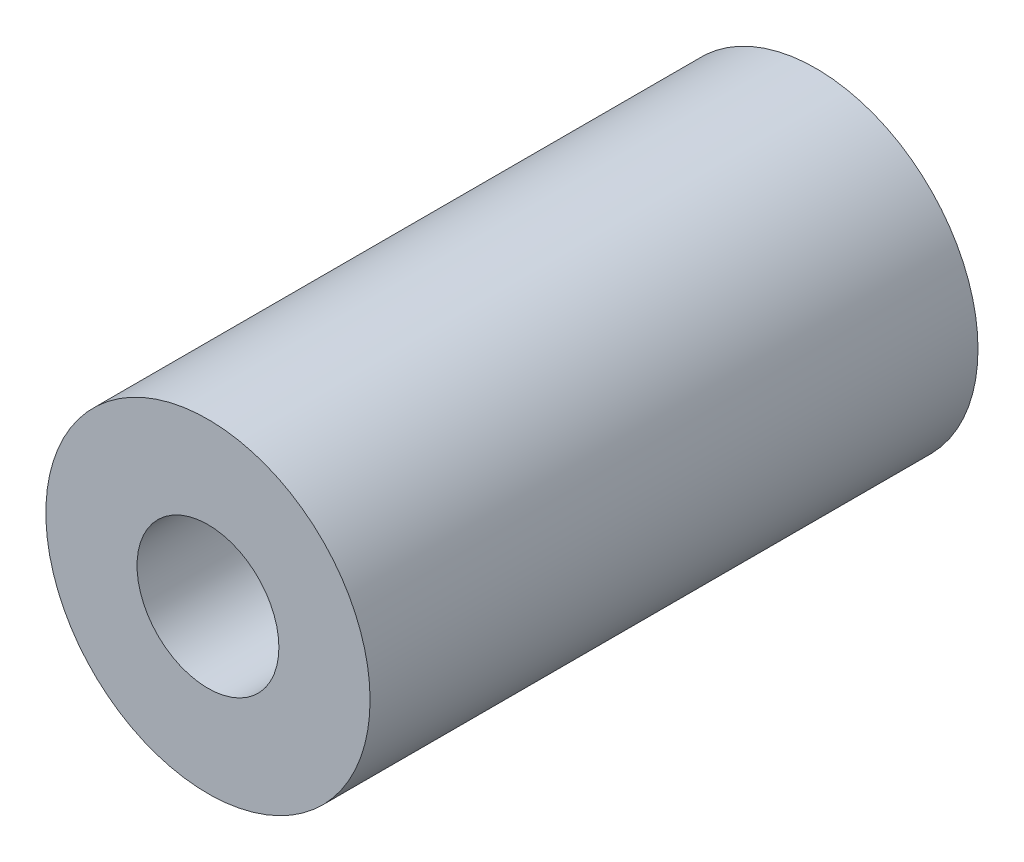
ISO-10303-21;
HEADER;
FILE_DESCRIPTION(('STEP AP214'),'2;1');
FILE_NAME('part.step','',(''),(''),'','','');
FILE_SCHEMA(('AUTOMOTIVE_DESIGN { 1 0 10303 214 1 1 1 1 }'));
ENDSEC;
DATA;
#1=APPLICATION_CONTEXT('core data for automotive mechanical design processes');
#2=APPLICATION_PROTOCOL_DEFINITION('international standard','automotive_design',2000,#1);
#3=PRODUCT_CONTEXT('',#1,'mechanical');
#4=PRODUCT('Part','Part','',(#3));
#5=PRODUCT_RELATED_PRODUCT_CATEGORY('part','',(#4));
#6=PRODUCT_DEFINITION_FORMATION('','',#4);
#7=PRODUCT_DEFINITION_CONTEXT('part definition',#1,'design');
#8=PRODUCT_DEFINITION('design','',#6,#7);
#9=PRODUCT_DEFINITION_SHAPE('','',#8);
#10=(LENGTH_UNIT() NAMED_UNIT(*) SI_UNIT(.MILLI.,.METRE.));
#11=(NAMED_UNIT(*) PLANE_ANGLE_UNIT() SI_UNIT($,.RADIAN.));
#12=(NAMED_UNIT(*) SI_UNIT($,.STERADIAN.) SOLID_ANGLE_UNIT());
#13=UNCERTAINTY_MEASURE_WITH_UNIT(LENGTH_MEASURE(1.E-05),#10,'distance_accuracy_value','');
#14=(GEOMETRIC_REPRESENTATION_CONTEXT(3) GLOBAL_UNCERTAINTY_ASSIGNED_CONTEXT((#13)) GLOBAL_UNIT_ASSIGNED_CONTEXT((#10,
#11,#12)) REPRESENTATION_CONTEXT('',''));
#15=CARTESIAN_POINT('',(0.,0.,0.));
#16=DIRECTION('',(0.,0.,1.));
#17=DIRECTION('',(1.,0.,0.));
#18=AXIS2_PLACEMENT_3D('',#15,#16,#17);
#19=CARTESIAN_POINT('',(0.,0.,7.5));
#20=DIRECTION('',(0.,0.,1.));
#21=DIRECTION('',(1.,0.,0.));
#22=AXIS2_PLACEMENT_3D('',#19,#20,#21);
#23=PLANE('',#22);
#24=CARTESIAN_POINT('',(0.,0.,7.5));
#25=DIRECTION('',(0.,0.,1.));
#26=DIRECTION('',(1.,0.,0.));
#27=AXIS2_PLACEMENT_3D('',#24,#25,#26);
#28=CIRCLE('',#27,4.);
#29=CARTESIAN_POINT('',(4.,0.,7.5));
#30=VERTEX_POINT('',#29);
#31=EDGE_CURVE('E10',#30,#30,#28,.T.);
#32=ORIENTED_EDGE('',*,*,#31,.T.);
#33=EDGE_LOOP('',(#32));
#34=FACE_BOUND('',#33,.T.);
#35=CARTESIAN_POINT('',(0.,0.,7.5));
#36=DIRECTION('',(0.,0.,1.));
#37=DIRECTION('',(1.,0.,0.));
#38=AXIS2_PLACEMENT_3D('',#35,#36,#37);
#39=CIRCLE('',#38,1.75);
#40=CARTESIAN_POINT('',(1.75,0.,7.5));
#41=VERTEX_POINT('',#40);
#42=EDGE_CURVE('E42',#41,#41,#39,.T.);
#43=ORIENTED_EDGE('',*,*,#42,.F.);
#44=EDGE_LOOP('',(#43));
#45=FACE_BOUND('',#44,.T.);
#46=ADVANCED_FACE('F31',(#34,#45),#23,.T.);
#47=CARTESIAN_POINT('',(0.,0.,-7.5));
#48=DIRECTION('',(0.,0.,1.));
#49=DIRECTION('',(1.,0.,0.));
#50=AXIS2_PLACEMENT_3D('',#47,#48,#49);
#51=PLANE('',#50);
#52=CARTESIAN_POINT('',(0.,0.,-7.5));
#53=DIRECTION('',(0.,0.,1.));
#54=DIRECTION('',(1.,0.,0.));
#55=AXIS2_PLACEMENT_3D('',#52,#53,#54);
#56=CIRCLE('',#55,4.);
#57=CARTESIAN_POINT('',(4.,0.,-7.5));
#58=VERTEX_POINT('',#57);
#59=EDGE_CURVE('E35',#58,#58,#56,.T.);
#60=ORIENTED_EDGE('',*,*,#59,.F.);
#61=EDGE_LOOP('',(#60));
#62=FACE_BOUND('',#61,.T.);
#63=CARTESIAN_POINT('',(0.,0.,-7.5));
#64=DIRECTION('',(0.,0.,1.));
#65=DIRECTION('',(1.,0.,0.));
#66=AXIS2_PLACEMENT_3D('',#63,#64,#65);
#67=CIRCLE('',#66,1.75);
#68=CARTESIAN_POINT('',(1.75,0.,-7.5));
#69=VERTEX_POINT('',#68);
#70=EDGE_CURVE('E44',#69,#69,#67,.T.);
#71=ORIENTED_EDGE('',*,*,#70,.T.);
#72=EDGE_LOOP('',(#71));
#73=FACE_BOUND('',#72,.T.);
#74=ADVANCED_FACE('F54',(#62,#73),#51,.F.);
#75=CARTESIAN_POINT('',(0.,0.,7.5));
#76=DIRECTION('',(0.,0.,-1.));
#77=DIRECTION('',(-1.,0.,0.));
#78=AXIS2_PLACEMENT_3D('',#75,#76,#77);
#79=CYLINDRICAL_SURFACE('',#78,4.);
#80=ORIENTED_EDGE('',*,*,#31,.F.);
#81=EDGE_LOOP('',(#80));
#82=FACE_BOUND('',#81,.T.);
#83=ORIENTED_EDGE('',*,*,#59,.T.);
#84=EDGE_LOOP('',(#83));
#85=FACE_BOUND('',#84,.T.);
#86=ADVANCED_FACE('F33',(#82,#85),#79,.T.);
#87=CARTESIAN_POINT('',(0.,0.,7.5));
#88=DIRECTION('',(0.,0.,-1.));
#89=DIRECTION('',(-1.,0.,0.));
#90=AXIS2_PLACEMENT_3D('',#87,#88,#89);
#91=CYLINDRICAL_SURFACE('',#90,1.75);
#92=ORIENTED_EDGE('',*,*,#42,.T.);
#93=EDGE_LOOP('',(#92));
#94=FACE_BOUND('',#93,.T.);
#95=ORIENTED_EDGE('',*,*,#70,.F.);
#96=EDGE_LOOP('',(#95));
#97=FACE_BOUND('',#96,.T.);
#98=ADVANCED_FACE('F50',(#94,#97),#91,.F.);
#99=CLOSED_SHELL('',(#46,#74,#86,#98));
#100=MANIFOLD_SOLID_BREP('B2',#99);
#101=ADVANCED_BREP_SHAPE_REPRESENTATION('',(#18,#100),#14);
#102=SHAPE_DEFINITION_REPRESENTATION(#9,#101);
ENDSEC;
END-ISO-10303-21;
